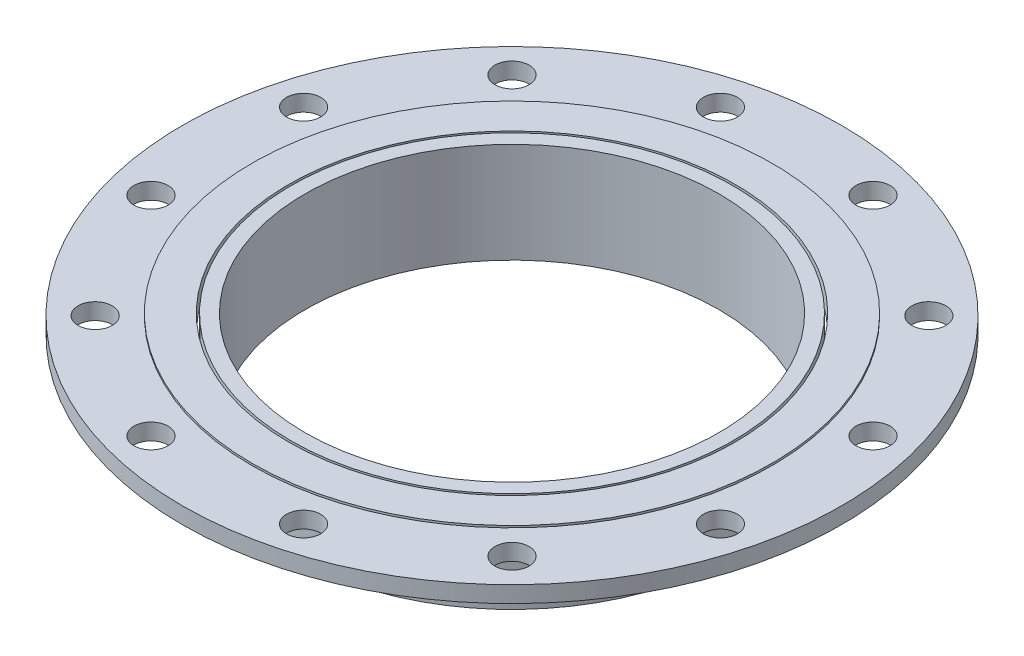
ISO-10303-21;
HEADER;
FILE_DESCRIPTION(('STEP AP214'),'2;1');
FILE_NAME('part.step','',(''),(''),'','','');
FILE_SCHEMA(('AUTOMOTIVE_DESIGN { 1 0 10303 214 1 1 1 1 }'));
ENDSEC;
DATA;
#1=APPLICATION_CONTEXT('core data for automotive mechanical design processes');
#2=APPLICATION_PROTOCOL_DEFINITION('international standard','automotive_design',2000,#1);
#3=PRODUCT_CONTEXT('',#1,'mechanical');
#4=PRODUCT('Part','Part','',(#3));
#5=PRODUCT_RELATED_PRODUCT_CATEGORY('part','',(#4));
#6=PRODUCT_DEFINITION_FORMATION('','',#4);
#7=PRODUCT_DEFINITION_CONTEXT('part definition',#1,'design');
#8=PRODUCT_DEFINITION('design','',#6,#7);
#9=PRODUCT_DEFINITION_SHAPE('','',#8);
#10=(LENGTH_UNIT() NAMED_UNIT(*) SI_UNIT(.MILLI.,.METRE.));
#11=(NAMED_UNIT(*) PLANE_ANGLE_UNIT() SI_UNIT($,.RADIAN.));
#12=(NAMED_UNIT(*) SI_UNIT($,.STERADIAN.) SOLID_ANGLE_UNIT());
#13=UNCERTAINTY_MEASURE_WITH_UNIT(LENGTH_MEASURE(1.E-05),#10,'distance_accuracy_value','');
#14=(GEOMETRIC_REPRESENTATION_CONTEXT(3) GLOBAL_UNCERTAINTY_ASSIGNED_CONTEXT((#13)) GLOBAL_UNIT_ASSIGNED_CONTEXT((#10,
#11,#12)) REPRESENTATION_CONTEXT('',''));
#15=CARTESIAN_POINT('',(0.,0.,0.));
#16=DIRECTION('',(0.,0.,1.));
#17=DIRECTION('',(1.,0.,0.));
#18=AXIS2_PLACEMENT_3D('',#15,#16,#17);
#19=CARTESIAN_POINT('',(0.,340.,0.));
#20=DIRECTION('',(0.,1.,0.));
#21=DIRECTION('',(0.,0.,1.));
#22=AXIS2_PLACEMENT_3D('',#19,#20,#21);
#23=CYLINDRICAL_SURFACE('',#22,161.95);
#24=CARTESIAN_POINT('',(0.,340.,0.));
#25=DIRECTION('',(0.,1.,0.));
#26=DIRECTION('',(0.,0.,1.));
#27=AXIS2_PLACEMENT_3D('',#24,#25,#26);
#28=CIRCLE('',#27,161.95);
#29=CARTESIAN_POINT('',(0.,340.,161.95));
#30=VERTEX_POINT('',#29);
#31=EDGE_CURVE('E12',#30,#30,#28,.T.);
#32=ORIENTED_EDGE('',*,*,#31,.T.);
#33=EDGE_LOOP('',(#32));
#34=FACE_BOUND('',#33,.T.);
#35=CARTESIAN_POINT('',(0.,413.5,0.));
#36=DIRECTION('',(0.,1.,0.));
#37=DIRECTION('',(0.,0.,1.));
#38=AXIS2_PLACEMENT_3D('',#35,#36,#37);
#39=CIRCLE('',#38,161.95);
#40=CARTESIAN_POINT('',(0.,413.5,161.95));
#41=VERTEX_POINT('',#40);
#42=EDGE_CURVE('E53',#41,#41,#39,.T.);
#43=ORIENTED_EDGE('',*,*,#42,.F.);
#44=EDGE_LOOP('',(#43));
#45=FACE_BOUND('',#44,.T.);
#46=ADVANCED_FACE('F50',(#34,#45),#23,.T.);
#47=CARTESIAN_POINT('',(0.,340.,0.));
#48=DIRECTION('',(0.,1.,0.));
#49=DIRECTION('',(0.,0.,1.));
#50=AXIS2_PLACEMENT_3D('',#47,#48,#49);
#51=PLANE('',#50);
#52=CARTESIAN_POINT('',(0.,340.,0.));
#53=DIRECTION('',(0.,1.,0.));
#54=DIRECTION('',(0.,0.,1.));
#55=AXIS2_PLACEMENT_3D('',#52,#53,#54);
#56=CIRCLE('',#55,151.64);
#57=CARTESIAN_POINT('',(0.,340.,151.64));
#58=VERTEX_POINT('',#57);
#59=EDGE_CURVE('E60',#58,#58,#56,.T.);
#60=ORIENTED_EDGE('',*,*,#59,.T.);
#61=EDGE_LOOP('',(#60));
#62=FACE_BOUND('',#61,.T.);
#63=ORIENTED_EDGE('',*,*,#31,.F.);
#64=EDGE_LOOP('',(#63));
#65=FACE_BOUND('',#64,.T.);
#66=ADVANCED_FACE('F68',(#62,#65),#51,.F.);
#67=CARTESIAN_POINT('',(0.,413.5,0.));
#68=DIRECTION('',(0.,1.,0.));
#69=DIRECTION('',(0.,0.,1.));
#70=AXIS2_PLACEMENT_3D('',#67,#68,#69);
#71=PLANE('',#70);
#72=CARTESIAN_POINT('',(0.,413.5,0.));
#73=DIRECTION('',(0.,1.,0.));
#74=DIRECTION('',(0.,0.,1.));
#75=AXIS2_PLACEMENT_3D('',#72,#73,#74);
#76=CIRCLE('',#75,151.64);
#77=CARTESIAN_POINT('',(0.,413.5,151.64));
#78=VERTEX_POINT('',#77);
#79=EDGE_CURVE('E62',#78,#78,#76,.T.);
#80=ORIENTED_EDGE('',*,*,#79,.F.);
#81=EDGE_LOOP('',(#80));
#82=FACE_BOUND('',#81,.T.);
#83=ORIENTED_EDGE('',*,*,#42,.T.);
#84=EDGE_LOOP('',(#83));
#85=FACE_BOUND('',#84,.T.);
#86=ADVANCED_FACE('F74',(#82,#85),#71,.T.);
#87=CARTESIAN_POINT('',(0.,340.,0.));
#88=DIRECTION('',(0.,1.,0.));
#89=DIRECTION('',(0.,0.,1.));
#90=AXIS2_PLACEMENT_3D('',#87,#88,#89);
#91=CYLINDRICAL_SURFACE('',#90,151.64);
#92=ORIENTED_EDGE('',*,*,#59,.F.);
#93=EDGE_LOOP('',(#92));
#94=FACE_BOUND('',#93,.T.);
#95=ORIENTED_EDGE('',*,*,#79,.T.);
#96=EDGE_LOOP('',(#95));
#97=FACE_BOUND('',#96,.T.);
#98=ADVANCED_FACE('F71',(#94,#97),#91,.F.);
#99=CLOSED_SHELL('',(#46,#66,#86,#98));
#100=MANIFOLD_SOLID_BREP('B2',#99);
#101=CARTESIAN_POINT('',(0.,412.,0.));
#102=DIRECTION('',(0.,1.,0.));
#103=DIRECTION('',(0.,0.,1.));
#104=AXIS2_PLACEMENT_3D('',#101,#102,#103);
#105=PLANE('',#104);
#106=CARTESIAN_POINT('',(0.,412.,0.));
#107=DIRECTION('',(0.,1.,0.));
#108=DIRECTION('',(0.,0.,1.));
#109=AXIS2_PLACEMENT_3D('',#106,#107,#108);
#110=CIRCLE('',#109,241.5);
#111=CARTESIAN_POINT('',(0.,412.,241.5));
#112=VERTEX_POINT('',#111);
#113=EDGE_CURVE('E49',#112,#112,#110,.T.);
#114=ORIENTED_EDGE('',*,*,#113,.T.);
#115=EDGE_LOOP('',(#114));
#116=FACE_BOUND('',#115,.T.);
#117=CARTESIAN_POINT('',(-55.9049137421447,412.,-208.639978478439));
#118=DIRECTION('',(0.,1.,0.));
#119=DIRECTION('',(0.,0.,1.));
#120=AXIS2_PLACEMENT_3D('',#117,#118,#119);
#121=CIRCLE('',#120,12.5);
#122=CARTESIAN_POINT('',(-55.9049137421447,412.,-196.139978478439));
#123=VERTEX_POINT('',#122);
#124=EDGE_CURVE('E133',#123,#123,#121,.T.);
#125=ORIENTED_EDGE('',*,*,#124,.F.);
#126=EDGE_LOOP('',(#125));
#127=FACE_BOUND('',#126,.T.);
#128=CARTESIAN_POINT('',(55.9049137421446,412.,-208.639978478439));
#129=DIRECTION('',(0.,1.,0.));
#130=DIRECTION('',(-0.500000000000001,0.,0.866025403784438));
#131=AXIS2_PLACEMENT_3D('',#128,#129,#130);
#132=CIRCLE('',#131,12.5);
#133=CARTESIAN_POINT('',(49.6549137421445,412.,-197.814660931133));
#134=VERTEX_POINT('',#133);
#135=EDGE_CURVE('E139',#134,#134,#132,.T.);
#136=ORIENTED_EDGE('',*,*,#135,.F.);
#137=EDGE_LOOP('',(#136));
#138=FACE_BOUND('',#137,.T.);
#139=CARTESIAN_POINT('',(152.735064736295,412.,-152.735064736294));
#140=DIRECTION('',(0.,1.,0.));
#141=DIRECTION('',(-0.86602540378444,0.,0.499999999999998));
#142=AXIS2_PLACEMENT_3D('',#139,#140,#141);
#143=CIRCLE('',#142,12.5);
#144=CARTESIAN_POINT('',(141.909747188989,412.,-146.485064736294));
#145=VERTEX_POINT('',#144);
#146=EDGE_CURVE('E145',#145,#145,#143,.T.);
#147=ORIENTED_EDGE('',*,*,#146,.F.);
#148=EDGE_LOOP('',(#147));
#149=FACE_BOUND('',#148,.T.);
#150=CARTESIAN_POINT('',(208.639978478439,412.,-55.9049137421439));
#151=DIRECTION('',(0.,1.,0.));
#152=DIRECTION('',(-1.,0.,0.));
#153=AXIS2_PLACEMENT_3D('',#150,#151,#152);
#154=CIRCLE('',#153,12.5);
#155=CARTESIAN_POINT('',(196.139978478439,412.,-55.904913742144));
#156=VERTEX_POINT('',#155);
#157=EDGE_CURVE('E151',#156,#156,#154,.T.);
#158=ORIENTED_EDGE('',*,*,#157,.F.);
#159=EDGE_LOOP('',(#158));
#160=FACE_BOUND('',#159,.T.);
#161=CARTESIAN_POINT('',(208.639978478439,412.,55.9049137421453));
#162=DIRECTION('',(0.,1.,0.));
#163=DIRECTION('',(-0.866025403784436,0.,-0.500000000000004));
#164=AXIS2_PLACEMENT_3D('',#161,#162,#163);
#165=CIRCLE('',#164,12.5);
#166=CARTESIAN_POINT('',(197.814660931133,412.,49.6549137421452));
#167=VERTEX_POINT('',#166);
#168=EDGE_CURVE('E157',#167,#167,#165,.T.);
#169=ORIENTED_EDGE('',*,*,#168,.F.);
#170=EDGE_LOOP('',(#169));
#171=FACE_BOUND('',#170,.T.);
#172=CARTESIAN_POINT('',(152.735064736294,412.,152.735064736295));
#173=DIRECTION('',(0.,1.,0.));
#174=DIRECTION('',(-0.499999999999995,0.,-0.866025403784442));
#175=AXIS2_PLACEMENT_3D('',#172,#173,#174);
#176=CIRCLE('',#175,12.5);
#177=CARTESIAN_POINT('',(146.485064736294,412.,141.90974718899));
#178=VERTEX_POINT('',#177);
#179=EDGE_CURVE('E163',#178,#178,#176,.T.);
#180=ORIENTED_EDGE('',*,*,#179,.F.);
#181=EDGE_LOOP('',(#180));
#182=FACE_BOUND('',#181,.T.);
#183=CARTESIAN_POINT('',(55.9049137421447,412.,208.639978478439));
#184=DIRECTION('',(0.,1.,0.));
#185=DIRECTION('',(0.,0.,-1.));
#186=AXIS2_PLACEMENT_3D('',#183,#184,#185);
#187=CIRCLE('',#186,12.5);
#188=CARTESIAN_POINT('',(55.9049137421447,412.,196.139978478439));
#189=VERTEX_POINT('',#188);
#190=EDGE_CURVE('E169',#189,#189,#187,.T.);
#191=ORIENTED_EDGE('',*,*,#190,.F.);
#192=EDGE_LOOP('',(#191));
#193=FACE_BOUND('',#192,.T.);
#194=CARTESIAN_POINT('',(-55.904913742146,412.,208.639978478438));
#195=DIRECTION('',(0.,1.,0.));
#196=DIRECTION('',(0.500000000000007,0.,-0.866025403784435));
#197=AXIS2_PLACEMENT_3D('',#194,#195,#196);
#198=CIRCLE('',#197,12.5);
#199=CARTESIAN_POINT('',(-49.6549137421459,412.,197.814660931133));
#200=VERTEX_POINT('',#199);
#201=EDGE_CURVE('E175',#200,#200,#198,.T.);
#202=ORIENTED_EDGE('',*,*,#201,.F.);
#203=EDGE_LOOP('',(#202));
#204=FACE_BOUND('',#203,.T.);
#205=CARTESIAN_POINT('',(-152.735064736296,412.,152.735064736293));
#206=DIRECTION('',(0.,1.,0.));
#207=DIRECTION('',(0.866025403784443,0.,-0.499999999999992));
#208=AXIS2_PLACEMENT_3D('',#205,#206,#207);
#209=CIRCLE('',#208,12.5);
#210=CARTESIAN_POINT('',(-141.90974718899,412.,146.485064736293));
#211=VERTEX_POINT('',#210);
#212=EDGE_CURVE('E181',#211,#211,#209,.T.);
#213=ORIENTED_EDGE('',*,*,#212,.F.);
#214=EDGE_LOOP('',(#213));
#215=FACE_BOUND('',#214,.T.);
#216=CARTESIAN_POINT('',(-208.639978478439,412.,55.9049137421425));
#217=DIRECTION('',(0.,1.,0.));
#218=DIRECTION('',(1.,0.,0.));
#219=AXIS2_PLACEMENT_3D('',#216,#217,#218);
#220=CIRCLE('',#219,12.5);
#221=CARTESIAN_POINT('',(-196.139978478439,412.,55.9049137421426));
#222=VERTEX_POINT('',#221);
#223=EDGE_CURVE('E187',#222,#222,#220,.T.);
#224=ORIENTED_EDGE('',*,*,#223,.F.);
#225=EDGE_LOOP('',(#224));
#226=FACE_BOUND('',#225,.T.);
#227=CARTESIAN_POINT('',(-208.639978478438,412.,-55.9049137421467));
#228=DIRECTION('',(0.,1.,0.));
#229=DIRECTION('',(0.866025403784433,0.,0.50000000000001));
#230=AXIS2_PLACEMENT_3D('',#227,#228,#229);
#231=CIRCLE('',#230,12.5);
#232=CARTESIAN_POINT('',(-197.814660931133,412.,-49.6549137421466));
#233=VERTEX_POINT('',#232);
#234=EDGE_CURVE('E193',#233,#233,#231,.T.);
#235=ORIENTED_EDGE('',*,*,#234,.F.);
#236=EDGE_LOOP('',(#235));
#237=FACE_BOUND('',#236,.T.);
#238=CARTESIAN_POINT('',(-152.735064736292,412.,-152.735064736296));
#239=DIRECTION('',(0.,1.,0.));
#240=DIRECTION('',(0.499999999999989,0.,0.866025403784445));
#241=AXIS2_PLACEMENT_3D('',#238,#239,#240);
#242=CIRCLE('',#241,12.5);
#243=CARTESIAN_POINT('',(-146.485064736293,412.,-141.909747188991));
#244=VERTEX_POINT('',#243);
#245=EDGE_CURVE('E199',#244,#244,#242,.T.);
#246=ORIENTED_EDGE('',*,*,#245,.F.);
#247=EDGE_LOOP('',(#246));
#248=FACE_BOUND('',#247,.T.);
#249=CARTESIAN_POINT('',(0.,412.,0.));
#250=DIRECTION('',(0.,1.,0.));
#251=DIRECTION('',(0.,0.,1.));
#252=AXIS2_PLACEMENT_3D('',#249,#250,#251);
#253=CIRCLE('',#252,190.5);
#254=CARTESIAN_POINT('',(0.,412.,190.5));
#255=VERTEX_POINT('',#254);
#256=EDGE_CURVE('E205',#255,#255,#253,.T.);
#257=ORIENTED_EDGE('',*,*,#256,.F.);
#258=EDGE_LOOP('',(#257));
#259=FACE_BOUND('',#258,.T.);
#260=ADVANCED_FACE('F117',(#116,#127,#138,#149,#160,#171,#182,#193,#204,#215,#226,#237,#248,
#259),#105,.T.);
#261=CARTESIAN_POINT('',(0.,400.,0.));
#262=DIRECTION('',(0.,1.,0.));
#263=DIRECTION('',(0.,0.,1.));
#264=AXIS2_PLACEMENT_3D('',#261,#262,#263);
#265=PLANE('',#264);
#266=CARTESIAN_POINT('',(-152.735064736292,400.,-152.735064736296));
#267=DIRECTION('',(0.,1.,0.));
#268=DIRECTION('',(0.499999999999989,0.,0.866025403784445));
#269=AXIS2_PLACEMENT_3D('',#266,#267,#268);
#270=CIRCLE('',#269,12.5);
#271=CARTESIAN_POINT('',(-146.485064736293,400.,-141.909747188991));
#272=VERTEX_POINT('',#271);
#273=EDGE_CURVE('E196',#272,#272,#270,.T.);
#274=ORIENTED_EDGE('',*,*,#273,.T.);
#275=EDGE_LOOP('',(#274));
#276=FACE_BOUND('',#275,.T.);
#277=CARTESIAN_POINT('',(-208.639978478438,400.,-55.9049137421467));
#278=DIRECTION('',(0.,1.,0.));
#279=DIRECTION('',(0.866025403784433,0.,0.50000000000001));
#280=AXIS2_PLACEMENT_3D('',#277,#278,#279);
#281=CIRCLE('',#280,12.5);
#282=CARTESIAN_POINT('',(-197.814660931133,400.,-49.6549137421466));
#283=VERTEX_POINT('',#282);
#284=EDGE_CURVE('E190',#283,#283,#281,.T.);
#285=ORIENTED_EDGE('',*,*,#284,.T.);
#286=EDGE_LOOP('',(#285));
#287=FACE_BOUND('',#286,.T.);
#288=CARTESIAN_POINT('',(-208.639978478439,400.,55.9049137421425));
#289=DIRECTION('',(0.,1.,0.));
#290=DIRECTION('',(1.,0.,0.));
#291=AXIS2_PLACEMENT_3D('',#288,#289,#290);
#292=CIRCLE('',#291,12.5);
#293=CARTESIAN_POINT('',(-196.139978478439,400.,55.9049137421426));
#294=VERTEX_POINT('',#293);
#295=EDGE_CURVE('E184',#294,#294,#292,.T.);
#296=ORIENTED_EDGE('',*,*,#295,.T.);
#297=EDGE_LOOP('',(#296));
#298=FACE_BOUND('',#297,.T.);
#299=CARTESIAN_POINT('',(-152.735064736296,400.,152.735064736293));
#300=DIRECTION('',(0.,1.,0.));
#301=DIRECTION('',(0.866025403784443,0.,-0.499999999999992));
#302=AXIS2_PLACEMENT_3D('',#299,#300,#301);
#303=CIRCLE('',#302,12.5);
#304=CARTESIAN_POINT('',(-141.90974718899,400.,146.485064736293));
#305=VERTEX_POINT('',#304);
#306=EDGE_CURVE('E178',#305,#305,#303,.T.);
#307=ORIENTED_EDGE('',*,*,#306,.T.);
#308=EDGE_LOOP('',(#307));
#309=FACE_BOUND('',#308,.T.);
#310=CARTESIAN_POINT('',(-55.904913742146,400.,208.639978478438));
#311=DIRECTION('',(0.,1.,0.));
#312=DIRECTION('',(0.500000000000007,0.,-0.866025403784435));
#313=AXIS2_PLACEMENT_3D('',#310,#311,#312);
#314=CIRCLE('',#313,12.5);
#315=CARTESIAN_POINT('',(-49.6549137421459,400.,197.814660931133));
#316=VERTEX_POINT('',#315);
#317=EDGE_CURVE('E172',#316,#316,#314,.T.);
#318=ORIENTED_EDGE('',*,*,#317,.T.);
#319=EDGE_LOOP('',(#318));
#320=FACE_BOUND('',#319,.T.);
#321=CARTESIAN_POINT('',(55.9049137421447,400.,208.639978478439));
#322=DIRECTION('',(0.,1.,0.));
#323=DIRECTION('',(0.,0.,-1.));
#324=AXIS2_PLACEMENT_3D('',#321,#322,#323);
#325=CIRCLE('',#324,12.5);
#326=CARTESIAN_POINT('',(55.9049137421447,400.,196.139978478439));
#327=VERTEX_POINT('',#326);
#328=EDGE_CURVE('E166',#327,#327,#325,.T.);
#329=ORIENTED_EDGE('',*,*,#328,.T.);
#330=EDGE_LOOP('',(#329));
#331=FACE_BOUND('',#330,.T.);
#332=CARTESIAN_POINT('',(152.735064736294,400.,152.735064736295));
#333=DIRECTION('',(0.,1.,0.));
#334=DIRECTION('',(-0.499999999999995,0.,-0.866025403784442));
#335=AXIS2_PLACEMENT_3D('',#332,#333,#334);
#336=CIRCLE('',#335,12.5);
#337=CARTESIAN_POINT('',(146.485064736294,400.,141.90974718899));
#338=VERTEX_POINT('',#337);
#339=EDGE_CURVE('E160',#338,#338,#336,.T.);
#340=ORIENTED_EDGE('',*,*,#339,.T.);
#341=EDGE_LOOP('',(#340));
#342=FACE_BOUND('',#341,.T.);
#343=CARTESIAN_POINT('',(208.639978478439,400.,55.9049137421453));
#344=DIRECTION('',(0.,1.,0.));
#345=DIRECTION('',(-0.866025403784436,0.,-0.500000000000004));
#346=AXIS2_PLACEMENT_3D('',#343,#344,#345);
#347=CIRCLE('',#346,12.5);
#348=CARTESIAN_POINT('',(197.814660931133,400.,49.6549137421452));
#349=VERTEX_POINT('',#348);
#350=EDGE_CURVE('E154',#349,#349,#347,.T.);
#351=ORIENTED_EDGE('',*,*,#350,.T.);
#352=EDGE_LOOP('',(#351));
#353=FACE_BOUND('',#352,.T.);
#354=CARTESIAN_POINT('',(208.639978478439,400.,-55.9049137421439));
#355=DIRECTION('',(0.,1.,0.));
#356=DIRECTION('',(-1.,0.,0.));
#357=AXIS2_PLACEMENT_3D('',#354,#355,#356);
#358=CIRCLE('',#357,12.5);
#359=CARTESIAN_POINT('',(196.139978478439,400.,-55.904913742144));
#360=VERTEX_POINT('',#359);
#361=EDGE_CURVE('E148',#360,#360,#358,.T.);
#362=ORIENTED_EDGE('',*,*,#361,.T.);
#363=EDGE_LOOP('',(#362));
#364=FACE_BOUND('',#363,.T.);
#365=CARTESIAN_POINT('',(152.735064736295,400.,-152.735064736294));
#366=DIRECTION('',(0.,1.,0.));
#367=DIRECTION('',(-0.86602540378444,0.,0.499999999999998));
#368=AXIS2_PLACEMENT_3D('',#365,#366,#367);
#369=CIRCLE('',#368,12.5);
#370=CARTESIAN_POINT('',(141.909747188989,400.,-146.485064736294));
#371=VERTEX_POINT('',#370);
#372=EDGE_CURVE('E142',#371,#371,#369,.T.);
#373=ORIENTED_EDGE('',*,*,#372,.T.);
#374=EDGE_LOOP('',(#373));
#375=FACE_BOUND('',#374,.T.);
#376=CARTESIAN_POINT('',(55.9049137421446,400.,-208.639978478439));
#377=DIRECTION('',(0.,1.,0.));
#378=DIRECTION('',(-0.500000000000001,0.,0.866025403784438));
#379=AXIS2_PLACEMENT_3D('',#376,#377,#378);
#380=CIRCLE('',#379,12.5);
#381=CARTESIAN_POINT('',(49.6549137421445,400.,-197.814660931133));
#382=VERTEX_POINT('',#381);
#383=EDGE_CURVE('E136',#382,#382,#380,.T.);
#384=ORIENTED_EDGE('',*,*,#383,.T.);
#385=EDGE_LOOP('',(#384));
#386=FACE_BOUND('',#385,.T.);
#387=CARTESIAN_POINT('',(-55.9049137421447,400.,-208.639978478439));
#388=DIRECTION('',(0.,1.,0.));
#389=DIRECTION('',(0.,0.,1.));
#390=AXIS2_PLACEMENT_3D('',#387,#388,#389);
#391=CIRCLE('',#390,12.5);
#392=CARTESIAN_POINT('',(-55.9049137421447,400.,-196.139978478439));
#393=VERTEX_POINT('',#392);
#394=EDGE_CURVE('E132',#393,#393,#391,.T.);
#395=ORIENTED_EDGE('',*,*,#394,.T.);
#396=EDGE_LOOP('',(#395));
#397=FACE_BOUND('',#396,.T.);
#398=CARTESIAN_POINT('',(0.,400.,0.));
#399=DIRECTION('',(0.,1.,0.));
#400=DIRECTION('',(0.,0.,1.));
#401=AXIS2_PLACEMENT_3D('',#398,#399,#400);
#402=CIRCLE('',#401,241.5);
#403=CARTESIAN_POINT('',(0.,400.,241.5));
#404=VERTEX_POINT('',#403);
#405=EDGE_CURVE('E121',#404,#404,#402,.T.);
#406=ORIENTED_EDGE('',*,*,#405,.F.);
#407=EDGE_LOOP('',(#406));
#408=FACE_BOUND('',#407,.T.);
#409=CARTESIAN_POINT('',(0.,400.,0.));
#410=DIRECTION('',(0.,1.,0.));
#411=DIRECTION('',(0.,0.,1.));
#412=AXIS2_PLACEMENT_3D('',#409,#410,#411);
#413=CIRCLE('',#412,163.6);
#414=CARTESIAN_POINT('',(0.,400.,163.6));
#415=VERTEX_POINT('',#414);
#416=EDGE_CURVE('E128',#415,#415,#413,.T.);
#417=ORIENTED_EDGE('',*,*,#416,.T.);
#418=EDGE_LOOP('',(#417));
#419=FACE_BOUND('',#418,.T.);
#420=ADVANCED_FACE('F232',(#276,#287,#298,#309,#320,#331,#342,#353,#364,#375,#386,#397,#408,
#419),#265,.F.);
#421=CARTESIAN_POINT('',(0.,412.,0.));
#422=DIRECTION('',(0.,-1.,0.));
#423=DIRECTION('',(0.,0.,-1.));
#424=AXIS2_PLACEMENT_3D('',#421,#422,#423);
#425=CYLINDRICAL_SURFACE('',#424,241.5);
#426=ORIENTED_EDGE('',*,*,#113,.F.);
#427=EDGE_LOOP('',(#426));
#428=FACE_BOUND('',#427,.T.);
#429=ORIENTED_EDGE('',*,*,#405,.T.);
#430=EDGE_LOOP('',(#429));
#431=FACE_BOUND('',#430,.T.);
#432=ADVANCED_FACE('F119',(#428,#431),#425,.T.);
#433=CARTESIAN_POINT('',(0.,412.,0.));
#434=DIRECTION('',(0.,-1.,0.));
#435=DIRECTION('',(0.,0.,-1.));
#436=AXIS2_PLACEMENT_3D('',#433,#434,#435);
#437=CYLINDRICAL_SURFACE('',#436,163.6);
#438=ORIENTED_EDGE('',*,*,#416,.F.);
#439=EDGE_LOOP('',(#438));
#440=FACE_BOUND('',#439,.T.);
#441=CARTESIAN_POINT('',(0.,413.5,0.));
#442=DIRECTION('',(0.,1.,0.));
#443=DIRECTION('',(0.,0.,1.));
#444=AXIS2_PLACEMENT_3D('',#441,#442,#443);
#445=CIRCLE('',#444,163.6);
#446=CARTESIAN_POINT('',(0.,413.5,163.6));
#447=VERTEX_POINT('',#446);
#448=EDGE_CURVE('E208',#447,#447,#445,.T.);
#449=ORIENTED_EDGE('',*,*,#448,.T.);
#450=EDGE_LOOP('',(#449));
#451=FACE_BOUND('',#450,.T.);
#452=ADVANCED_FACE('F214',(#440,#451),#437,.F.);
#453=CARTESIAN_POINT('',(-55.9049137421447,400.,-208.639978478439));
#454=DIRECTION('',(0.,1.,0.));
#455=DIRECTION('',(0.,0.,1.));
#456=AXIS2_PLACEMENT_3D('',#453,#454,#455);
#457=CYLINDRICAL_SURFACE('',#456,12.5);
#458=ORIENTED_EDGE('',*,*,#394,.F.);
#459=EDGE_LOOP('',(#458));
#460=FACE_BOUND('',#459,.T.);
#461=ORIENTED_EDGE('',*,*,#124,.T.);
#462=EDGE_LOOP('',(#461));
#463=FACE_BOUND('',#462,.T.);
#464=ADVANCED_FACE('F242',(#460,#463),#457,.F.);
#465=CARTESIAN_POINT('',(55.9049137421446,400.,-208.639978478439));
#466=DIRECTION('',(0.,1.,0.));
#467=DIRECTION('',(0.,0.,1.));
#468=AXIS2_PLACEMENT_3D('',#465,#466,#467);
#469=CYLINDRICAL_SURFACE('',#468,12.5);
#470=ORIENTED_EDGE('',*,*,#383,.F.);
#471=EDGE_LOOP('',(#470));
#472=FACE_BOUND('',#471,.T.);
#473=ORIENTED_EDGE('',*,*,#135,.T.);
#474=EDGE_LOOP('',(#473));
#475=FACE_BOUND('',#474,.T.);
#476=ADVANCED_FACE('F246',(#472,#475),#469,.F.);
#477=CARTESIAN_POINT('',(152.735064736295,400.,-152.735064736294));
#478=DIRECTION('',(0.,1.,0.));
#479=DIRECTION('',(0.,0.,1.));
#480=AXIS2_PLACEMENT_3D('',#477,#478,#479);
#481=CYLINDRICAL_SURFACE('',#480,12.5);
#482=ORIENTED_EDGE('',*,*,#372,.F.);
#483=EDGE_LOOP('',(#482));
#484=FACE_BOUND('',#483,.T.);
#485=ORIENTED_EDGE('',*,*,#146,.T.);
#486=EDGE_LOOP('',(#485));
#487=FACE_BOUND('',#486,.T.);
#488=ADVANCED_FACE('F250',(#484,#487),#481,.F.);
#489=CARTESIAN_POINT('',(208.639978478439,400.,-55.9049137421439));
#490=DIRECTION('',(0.,1.,0.));
#491=DIRECTION('',(0.,0.,1.));
#492=AXIS2_PLACEMENT_3D('',#489,#490,#491);
#493=CYLINDRICAL_SURFACE('',#492,12.5);
#494=ORIENTED_EDGE('',*,*,#361,.F.);
#495=EDGE_LOOP('',(#494));
#496=FACE_BOUND('',#495,.T.);
#497=ORIENTED_EDGE('',*,*,#157,.T.);
#498=EDGE_LOOP('',(#497));
#499=FACE_BOUND('',#498,.T.);
#500=ADVANCED_FACE('F254',(#496,#499),#493,.F.);
#501=CARTESIAN_POINT('',(208.639978478439,400.,55.9049137421453));
#502=DIRECTION('',(0.,1.,0.));
#503=DIRECTION('',(0.,0.,1.));
#504=AXIS2_PLACEMENT_3D('',#501,#502,#503);
#505=CYLINDRICAL_SURFACE('',#504,12.5);
#506=ORIENTED_EDGE('',*,*,#350,.F.);
#507=EDGE_LOOP('',(#506));
#508=FACE_BOUND('',#507,.T.);
#509=ORIENTED_EDGE('',*,*,#168,.T.);
#510=EDGE_LOOP('',(#509));
#511=FACE_BOUND('',#510,.T.);
#512=ADVANCED_FACE('F258',(#508,#511),#505,.F.);
#513=CARTESIAN_POINT('',(152.735064736294,400.,152.735064736295));
#514=DIRECTION('',(0.,1.,0.));
#515=DIRECTION('',(0.,0.,1.));
#516=AXIS2_PLACEMENT_3D('',#513,#514,#515);
#517=CYLINDRICAL_SURFACE('',#516,12.5);
#518=ORIENTED_EDGE('',*,*,#339,.F.);
#519=EDGE_LOOP('',(#518));
#520=FACE_BOUND('',#519,.T.);
#521=ORIENTED_EDGE('',*,*,#179,.T.);
#522=EDGE_LOOP('',(#521));
#523=FACE_BOUND('',#522,.T.);
#524=ADVANCED_FACE('F262',(#520,#523),#517,.F.);
#525=CARTESIAN_POINT('',(55.9049137421447,400.,208.639978478439));
#526=DIRECTION('',(0.,1.,0.));
#527=DIRECTION('',(0.,0.,1.));
#528=AXIS2_PLACEMENT_3D('',#525,#526,#527);
#529=CYLINDRICAL_SURFACE('',#528,12.5);
#530=ORIENTED_EDGE('',*,*,#328,.F.);
#531=EDGE_LOOP('',(#530));
#532=FACE_BOUND('',#531,.T.);
#533=ORIENTED_EDGE('',*,*,#190,.T.);
#534=EDGE_LOOP('',(#533));
#535=FACE_BOUND('',#534,.T.);
#536=ADVANCED_FACE('F266',(#532,#535),#529,.F.);
#537=CARTESIAN_POINT('',(-55.904913742146,400.,208.639978478438));
#538=DIRECTION('',(0.,1.,0.));
#539=DIRECTION('',(0.,0.,1.));
#540=AXIS2_PLACEMENT_3D('',#537,#538,#539);
#541=CYLINDRICAL_SURFACE('',#540,12.5);
#542=ORIENTED_EDGE('',*,*,#317,.F.);
#543=EDGE_LOOP('',(#542));
#544=FACE_BOUND('',#543,.T.);
#545=ORIENTED_EDGE('',*,*,#201,.T.);
#546=EDGE_LOOP('',(#545));
#547=FACE_BOUND('',#546,.T.);
#548=ADVANCED_FACE('F270',(#544,#547),#541,.F.);
#549=CARTESIAN_POINT('',(-152.735064736296,400.,152.735064736293));
#550=DIRECTION('',(0.,1.,0.));
#551=DIRECTION('',(0.,0.,1.));
#552=AXIS2_PLACEMENT_3D('',#549,#550,#551);
#553=CYLINDRICAL_SURFACE('',#552,12.5);
#554=ORIENTED_EDGE('',*,*,#306,.F.);
#555=EDGE_LOOP('',(#554));
#556=FACE_BOUND('',#555,.T.);
#557=ORIENTED_EDGE('',*,*,#212,.T.);
#558=EDGE_LOOP('',(#557));
#559=FACE_BOUND('',#558,.T.);
#560=ADVANCED_FACE('F274',(#556,#559),#553,.F.);
#561=CARTESIAN_POINT('',(-208.639978478439,400.,55.9049137421425));
#562=DIRECTION('',(0.,1.,0.));
#563=DIRECTION('',(0.,0.,1.));
#564=AXIS2_PLACEMENT_3D('',#561,#562,#563);
#565=CYLINDRICAL_SURFACE('',#564,12.5);
#566=ORIENTED_EDGE('',*,*,#295,.F.);
#567=EDGE_LOOP('',(#566));
#568=FACE_BOUND('',#567,.T.);
#569=ORIENTED_EDGE('',*,*,#223,.T.);
#570=EDGE_LOOP('',(#569));
#571=FACE_BOUND('',#570,.T.);
#572=ADVANCED_FACE('F278',(#568,#571),#565,.F.);
#573=CARTESIAN_POINT('',(-208.639978478438,400.,-55.9049137421467));
#574=DIRECTION('',(0.,1.,0.));
#575=DIRECTION('',(0.,0.,1.));
#576=AXIS2_PLACEMENT_3D('',#573,#574,#575);
#577=CYLINDRICAL_SURFACE('',#576,12.5);
#578=ORIENTED_EDGE('',*,*,#284,.F.);
#579=EDGE_LOOP('',(#578));
#580=FACE_BOUND('',#579,.T.);
#581=ORIENTED_EDGE('',*,*,#234,.T.);
#582=EDGE_LOOP('',(#581));
#583=FACE_BOUND('',#582,.T.);
#584=ADVANCED_FACE('F228',(#580,#583),#577,.F.);
#585=CARTESIAN_POINT('',(-152.735064736292,400.,-152.735064736296));
#586=DIRECTION('',(0.,1.,0.));
#587=DIRECTION('',(0.,0.,1.));
#588=AXIS2_PLACEMENT_3D('',#585,#586,#587);
#589=CYLINDRICAL_SURFACE('',#588,12.5);
#590=ORIENTED_EDGE('',*,*,#273,.F.);
#591=EDGE_LOOP('',(#590));
#592=FACE_BOUND('',#591,.T.);
#593=ORIENTED_EDGE('',*,*,#245,.T.);
#594=EDGE_LOOP('',(#593));
#595=FACE_BOUND('',#594,.T.);
#596=ADVANCED_FACE('F219',(#592,#595),#589,.F.);
#597=CARTESIAN_POINT('',(0.,413.5,0.));
#598=DIRECTION('',(0.,1.,0.));
#599=DIRECTION('',(0.,0.,1.));
#600=AXIS2_PLACEMENT_3D('',#597,#598,#599);
#601=PLANE('',#600);
#602=CARTESIAN_POINT('',(0.,413.5,0.));
#603=DIRECTION('',(0.,1.,0.));
#604=DIRECTION('',(0.,0.,1.));
#605=AXIS2_PLACEMENT_3D('',#602,#603,#604);
#606=CIRCLE('',#605,190.5);
#607=CARTESIAN_POINT('',(0.,413.5,190.5));
#608=VERTEX_POINT('',#607);
#609=EDGE_CURVE('E202',#608,#608,#606,.T.);
#610=ORIENTED_EDGE('',*,*,#609,.T.);
#611=EDGE_LOOP('',(#610));
#612=FACE_BOUND('',#611,.T.);
#613=ORIENTED_EDGE('',*,*,#448,.F.);
#614=EDGE_LOOP('',(#613));
#615=FACE_BOUND('',#614,.T.);
#616=ADVANCED_FACE('F216',(#612,#615),#601,.T.);
#617=CARTESIAN_POINT('',(0.,413.5,0.));
#618=DIRECTION('',(0.,-1.,0.));
#619=DIRECTION('',(0.,0.,-1.));
#620=AXIS2_PLACEMENT_3D('',#617,#618,#619);
#621=CYLINDRICAL_SURFACE('',#620,190.5);
#622=ORIENTED_EDGE('',*,*,#609,.F.);
#623=EDGE_LOOP('',(#622));
#624=FACE_BOUND('',#623,.T.);
#625=ORIENTED_EDGE('',*,*,#256,.T.);
#626=EDGE_LOOP('',(#625));
#627=FACE_BOUND('',#626,.T.);
#628=ADVANCED_FACE('F218',(#624,#627),#621,.T.);
#629=CLOSED_SHELL('',(#260,#420,#432,#452,#464,#476,#488,#500,#512,#524,#536,#548,#560,#572,
#584,#596,#616,#628));
#630=MANIFOLD_SOLID_BREP('B7',#629);
#631=ADVANCED_BREP_SHAPE_REPRESENTATION('',(#18,#100,#630),#14);
#632=SHAPE_DEFINITION_REPRESENTATION(#9,#631);
ENDSEC;
END-ISO-10303-21;
